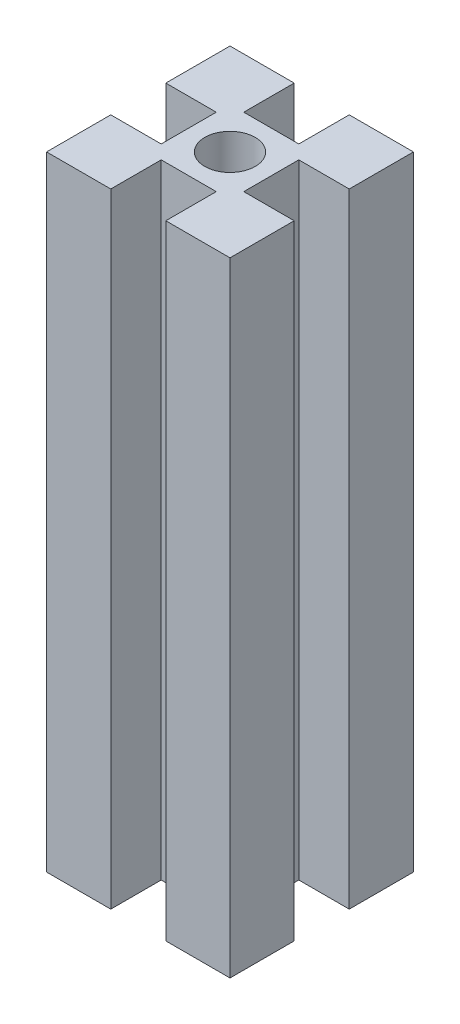
ISO-10303-21;
HEADER;
FILE_DESCRIPTION(('STEP AP214'),'2;1');
FILE_NAME('part.step','',(''),(''),'','','');
FILE_SCHEMA(('AUTOMOTIVE_DESIGN { 1 0 10303 214 1 1 1 1 }'));
ENDSEC;
DATA;
#1=APPLICATION_CONTEXT('core data for automotive mechanical design processes');
#2=APPLICATION_PROTOCOL_DEFINITION('international standard','automotive_design',2000,#1);
#3=PRODUCT_CONTEXT('',#1,'mechanical');
#4=PRODUCT('Part','Part','',(#3));
#5=PRODUCT_RELATED_PRODUCT_CATEGORY('part','',(#4));
#6=PRODUCT_DEFINITION_FORMATION('','',#4);
#7=PRODUCT_DEFINITION_CONTEXT('part definition',#1,'design');
#8=PRODUCT_DEFINITION('design','',#6,#7);
#9=PRODUCT_DEFINITION_SHAPE('','',#8);
#10=(LENGTH_UNIT() NAMED_UNIT(*) SI_UNIT(.MILLI.,.METRE.));
#11=(NAMED_UNIT(*) PLANE_ANGLE_UNIT() SI_UNIT($,.RADIAN.));
#12=(NAMED_UNIT(*) SI_UNIT($,.STERADIAN.) SOLID_ANGLE_UNIT());
#13=UNCERTAINTY_MEASURE_WITH_UNIT(LENGTH_MEASURE(1.E-05),#10,'distance_accuracy_value','');
#14=(GEOMETRIC_REPRESENTATION_CONTEXT(3) GLOBAL_UNCERTAINTY_ASSIGNED_CONTEXT((#13)) GLOBAL_UNIT_ASSIGNED_CONTEXT((#10,
#11,#12)) REPRESENTATION_CONTEXT('',''));
#15=CARTESIAN_POINT('',(0.,0.,0.));
#16=DIRECTION('',(0.,0.,1.));
#17=DIRECTION('',(1.,0.,0.));
#18=AXIS2_PLACEMENT_3D('',#15,#16,#17);
#19=CARTESIAN_POINT('',(-10.,68.,10.));
#20=DIRECTION('',(1.,0.,0.));
#21=DIRECTION('',(0.,0.,-1.));
#22=AXIS2_PLACEMENT_3D('',#19,#20,#21);
#23=PLANE('',#22);
#24=DIRECTION('',(0.,0.,1.));
#25=VECTOR('',#24,1.);
#26=CARTESIAN_POINT('',(-10.,68.,10.));
#27=LINE('',#26,#25);
#28=CARTESIAN_POINT('',(-10.,68.,3.));
#29=VERTEX_POINT('',#28);
#30=CARTESIAN_POINT('',(-10.,68.,10.));
#31=VERTEX_POINT('',#30);
#32=EDGE_CURVE('E295',#29,#31,#27,.T.);
#33=ORIENTED_EDGE('',*,*,#32,.F.);
#34=DIRECTION('',(0.,1.,0.));
#35=VECTOR('',#34,1.);
#36=CARTESIAN_POINT('',(-10.,0.,3.));
#37=LINE('',#36,#35);
#38=CARTESIAN_POINT('',(-10.,0.,3.));
#39=VERTEX_POINT('',#38);
#40=EDGE_CURVE('E203',#39,#29,#37,.T.);
#41=ORIENTED_EDGE('',*,*,#40,.F.);
#42=DIRECTION('',(0.,0.,1.));
#43=VECTOR('',#42,1.);
#44=CARTESIAN_POINT('',(-10.,0.,10.));
#45=LINE('',#44,#43);
#46=CARTESIAN_POINT('',(-10.,0.,10.));
#47=VERTEX_POINT('',#46);
#48=EDGE_CURVE('E288',#39,#47,#45,.T.);
#49=ORIENTED_EDGE('',*,*,#48,.T.);
#50=DIRECTION('',(0.,-1.,0.));
#51=VECTOR('',#50,1.);
#52=CARTESIAN_POINT('',(-10.,68.,10.));
#53=LINE('',#52,#51);
#54=EDGE_CURVE('E11',#31,#47,#53,.T.);
#55=ORIENTED_EDGE('',*,*,#54,.F.);
#56=EDGE_LOOP('',(#33,#41,#49,#55));
#57=FACE_BOUND('',#56,.T.);
#58=ADVANCED_FACE('F33',(#57),#23,.F.);
#59=CARTESIAN_POINT('',(10.,68.,10.));
#60=DIRECTION('',(0.,0.,-1.));
#61=DIRECTION('',(-1.,0.,0.));
#62=AXIS2_PLACEMENT_3D('',#59,#60,#61);
#63=PLANE('',#62);
#64=DIRECTION('',(1.,0.,0.));
#65=VECTOR('',#64,1.);
#66=CARTESIAN_POINT('',(10.,68.,10.));
#67=LINE('',#66,#65);
#68=CARTESIAN_POINT('',(3.,68.,10.));
#69=VERTEX_POINT('',#68);
#70=CARTESIAN_POINT('',(10.,68.,10.));
#71=VERTEX_POINT('',#70);
#72=EDGE_CURVE('E294',#69,#71,#67,.T.);
#73=ORIENTED_EDGE('',*,*,#72,.F.);
#74=DIRECTION('',(0.,1.,0.));
#75=VECTOR('',#74,1.);
#76=CARTESIAN_POINT('',(3.,0.,10.));
#77=LINE('',#76,#75);
#78=CARTESIAN_POINT('',(3.,0.,10.));
#79=VERTEX_POINT('',#78);
#80=EDGE_CURVE('E205',#79,#69,#77,.T.);
#81=ORIENTED_EDGE('',*,*,#80,.F.);
#82=DIRECTION('',(1.,0.,0.));
#83=VECTOR('',#82,1.);
#84=CARTESIAN_POINT('',(10.,0.,10.));
#85=LINE('',#84,#83);
#86=CARTESIAN_POINT('',(10.,0.,10.));
#87=VERTEX_POINT('',#86);
#88=EDGE_CURVE('E195',#79,#87,#85,.T.);
#89=ORIENTED_EDGE('',*,*,#88,.T.);
#90=DIRECTION('',(0.,-1.,0.));
#91=VECTOR('',#90,1.);
#92=CARTESIAN_POINT('',(10.,68.,10.));
#93=LINE('',#92,#91);
#94=EDGE_CURVE('E41',#71,#87,#93,.T.);
#95=ORIENTED_EDGE('',*,*,#94,.F.);
#96=EDGE_LOOP('',(#73,#81,#89,#95));
#97=FACE_BOUND('',#96,.T.);
#98=ADVANCED_FACE('F344',(#97),#63,.F.);
#99=CARTESIAN_POINT('',(10.,68.,10.));
#100=DIRECTION('',(-1.,0.,0.));
#101=DIRECTION('',(0.,0.,1.));
#102=AXIS2_PLACEMENT_3D('',#99,#100,#101);
#103=PLANE('',#102);
#104=DIRECTION('',(0.,0.,-1.));
#105=VECTOR('',#104,1.);
#106=CARTESIAN_POINT('',(10.,68.,10.));
#107=LINE('',#106,#105);
#108=CARTESIAN_POINT('',(10.,68.,-3.));
#109=VERTEX_POINT('',#108);
#110=CARTESIAN_POINT('',(10.,68.,-10.));
#111=VERTEX_POINT('',#110);
#112=EDGE_CURVE('E299',#109,#111,#107,.T.);
#113=ORIENTED_EDGE('',*,*,#112,.F.);
#114=DIRECTION('',(0.,1.,0.));
#115=VECTOR('',#114,1.);
#116=CARTESIAN_POINT('',(10.,0.,-3.));
#117=LINE('',#116,#115);
#118=CARTESIAN_POINT('',(10.,0.,-3.));
#119=VERTEX_POINT('',#118);
#120=EDGE_CURVE('E250',#119,#109,#117,.T.);
#121=ORIENTED_EDGE('',*,*,#120,.F.);
#122=DIRECTION('',(0.,0.,-1.));
#123=VECTOR('',#122,1.);
#124=CARTESIAN_POINT('',(10.,0.,10.));
#125=LINE('',#124,#123);
#126=CARTESIAN_POINT('',(10.,0.,-10.));
#127=VERTEX_POINT('',#126);
#128=EDGE_CURVE('E314',#119,#127,#125,.T.);
#129=ORIENTED_EDGE('',*,*,#128,.T.);
#130=DIRECTION('',(0.,-1.,0.));
#131=VECTOR('',#130,1.);
#132=CARTESIAN_POINT('',(10.,68.,-10.));
#133=LINE('',#132,#131);
#134=EDGE_CURVE('E324',#111,#127,#133,.T.);
#135=ORIENTED_EDGE('',*,*,#134,.F.);
#136=EDGE_LOOP('',(#113,#121,#129,#135));
#137=FACE_BOUND('',#136,.T.);
#138=ADVANCED_FACE('F346',(#137),#103,.F.);
#139=CARTESIAN_POINT('',(10.,68.,-10.));
#140=DIRECTION('',(0.,0.,1.));
#141=DIRECTION('',(1.,0.,0.));
#142=AXIS2_PLACEMENT_3D('',#139,#140,#141);
#143=PLANE('',#142);
#144=DIRECTION('',(-1.,0.,0.));
#145=VECTOR('',#144,1.);
#146=CARTESIAN_POINT('',(10.,68.,-10.));
#147=LINE('',#146,#145);
#148=CARTESIAN_POINT('',(-3.,68.,-10.));
#149=VERTEX_POINT('',#148);
#150=CARTESIAN_POINT('',(-10.,68.,-10.));
#151=VERTEX_POINT('',#150);
#152=EDGE_CURVE('E303',#149,#151,#147,.T.);
#153=ORIENTED_EDGE('',*,*,#152,.F.);
#154=DIRECTION('',(0.,1.,0.));
#155=VECTOR('',#154,1.);
#156=CARTESIAN_POINT('',(-3.,0.,-10.));
#157=LINE('',#156,#155);
#158=CARTESIAN_POINT('',(-3.,0.,-10.));
#159=VERTEX_POINT('',#158);
#160=EDGE_CURVE('E254',#159,#149,#157,.T.);
#161=ORIENTED_EDGE('',*,*,#160,.F.);
#162=DIRECTION('',(-1.,0.,0.));
#163=VECTOR('',#162,1.);
#164=CARTESIAN_POINT('',(10.,0.,-10.));
#165=LINE('',#164,#163);
#166=CARTESIAN_POINT('',(-10.,0.,-10.));
#167=VERTEX_POINT('',#166);
#168=EDGE_CURVE('E318',#159,#167,#165,.T.);
#169=ORIENTED_EDGE('',*,*,#168,.T.);
#170=DIRECTION('',(0.,-1.,0.));
#171=VECTOR('',#170,1.);
#172=CARTESIAN_POINT('',(-10.,68.,-10.));
#173=LINE('',#172,#171);
#174=EDGE_CURVE('E307',#151,#167,#173,.T.);
#175=ORIENTED_EDGE('',*,*,#174,.F.);
#176=EDGE_LOOP('',(#153,#161,#169,#175));
#177=FACE_BOUND('',#176,.T.);
#178=ADVANCED_FACE('F352',(#177),#143,.F.);
#179=CARTESIAN_POINT('',(-10.,0.,-3.));
#180=VERTEX_POINT('',#179);
#181=EDGE_CURVE('E308',#167,#180,#45,.T.);
#182=ORIENTED_EDGE('',*,*,#181,.T.);
#183=DIRECTION('',(0.,1.,0.));
#184=VECTOR('',#183,1.);
#185=CARTESIAN_POINT('',(-10.,0.,-3.));
#186=LINE('',#185,#184);
#187=CARTESIAN_POINT('',(-10.,68.,-3.));
#188=VERTEX_POINT('',#187);
#189=EDGE_CURVE('E231',#180,#188,#186,.T.);
#190=ORIENTED_EDGE('',*,*,#189,.T.);
#191=EDGE_CURVE('E291',#151,#188,#27,.T.);
#192=ORIENTED_EDGE('',*,*,#191,.F.);
#193=ORIENTED_EDGE('',*,*,#174,.T.);
#194=EDGE_LOOP('',(#182,#190,#192,#193));
#195=FACE_BOUND('',#194,.T.);
#196=ADVANCED_FACE('F35',(#195),#23,.F.);
#197=CARTESIAN_POINT('',(-3.,0.,10.));
#198=VERTEX_POINT('',#197);
#199=EDGE_CURVE('E311',#47,#198,#85,.T.);
#200=ORIENTED_EDGE('',*,*,#199,.T.);
#201=DIRECTION('',(0.,1.,0.));
#202=VECTOR('',#201,1.);
#203=CARTESIAN_POINT('',(-3.,0.,10.));
#204=LINE('',#203,#202);
#205=CARTESIAN_POINT('',(-3.,68.,10.));
#206=VERTEX_POINT('',#205);
#207=EDGE_CURVE('E208',#198,#206,#204,.T.);
#208=ORIENTED_EDGE('',*,*,#207,.T.);
#209=EDGE_CURVE('E296',#31,#206,#67,.T.);
#210=ORIENTED_EDGE('',*,*,#209,.F.);
#211=ORIENTED_EDGE('',*,*,#54,.T.);
#212=EDGE_LOOP('',(#200,#208,#210,#211));
#213=FACE_BOUND('',#212,.T.);
#214=ADVANCED_FACE('F347',(#213),#63,.F.);
#215=CARTESIAN_POINT('',(10.,0.,3.));
#216=VERTEX_POINT('',#215);
#217=EDGE_CURVE('E315',#87,#216,#125,.T.);
#218=ORIENTED_EDGE('',*,*,#217,.T.);
#219=DIRECTION('',(0.,1.,0.));
#220=VECTOR('',#219,1.);
#221=CARTESIAN_POINT('',(10.,0.,3.));
#222=LINE('',#221,#220);
#223=CARTESIAN_POINT('',(10.,68.,3.));
#224=VERTEX_POINT('',#223);
#225=EDGE_CURVE('E279',#216,#224,#222,.T.);
#226=ORIENTED_EDGE('',*,*,#225,.T.);
#227=EDGE_CURVE('E300',#71,#224,#107,.T.);
#228=ORIENTED_EDGE('',*,*,#227,.F.);
#229=ORIENTED_EDGE('',*,*,#94,.T.);
#230=EDGE_LOOP('',(#218,#226,#228,#229));
#231=FACE_BOUND('',#230,.T.);
#232=ADVANCED_FACE('F330',(#231),#103,.F.);
#233=CARTESIAN_POINT('',(3.,0.,-10.));
#234=VERTEX_POINT('',#233);
#235=EDGE_CURVE('E319',#127,#234,#165,.T.);
#236=ORIENTED_EDGE('',*,*,#235,.T.);
#237=DIRECTION('',(0.,1.,0.));
#238=VECTOR('',#237,1.);
#239=CARTESIAN_POINT('',(3.,0.,-10.));
#240=LINE('',#239,#238);
#241=CARTESIAN_POINT('',(3.,68.,-10.));
#242=VERTEX_POINT('',#241);
#243=EDGE_CURVE('E257',#234,#242,#240,.T.);
#244=ORIENTED_EDGE('',*,*,#243,.T.);
#245=EDGE_CURVE('E304',#111,#242,#147,.T.);
#246=ORIENTED_EDGE('',*,*,#245,.F.);
#247=ORIENTED_EDGE('',*,*,#134,.T.);
#248=EDGE_LOOP('',(#236,#244,#246,#247));
#249=FACE_BOUND('',#248,.T.);
#250=ADVANCED_FACE('F362',(#249),#143,.F.);
#251=CARTESIAN_POINT('',(0.,68.,0.));
#252=DIRECTION('',(0.,1.,0.));
#253=DIRECTION('',(0.,0.,1.));
#254=AXIS2_PLACEMENT_3D('',#251,#252,#253);
#255=PLANE('',#254);
#256=DIRECTION('',(0.,0.,1.));
#257=VECTOR('',#256,1.);
#258=CARTESIAN_POINT('',(-3.,68.,-10.));
#259=LINE('',#258,#257);
#260=CARTESIAN_POINT('',(-3.,68.,-4.5));
#261=VERTEX_POINT('',#260);
#262=EDGE_CURVE('E246',#149,#261,#259,.T.);
#263=ORIENTED_EDGE('',*,*,#262,.F.);
#264=ORIENTED_EDGE('',*,*,#152,.T.);
#265=ORIENTED_EDGE('',*,*,#191,.T.);
#266=DIRECTION('',(-1.,0.,0.));
#267=VECTOR('',#266,1.);
#268=CARTESIAN_POINT('',(-10.,68.,-3.));
#269=LINE('',#268,#267);
#270=CARTESIAN_POINT('',(-4.5,68.,-3.));
#271=VERTEX_POINT('',#270);
#272=EDGE_CURVE('E216',#271,#188,#269,.T.);
#273=ORIENTED_EDGE('',*,*,#272,.F.);
#274=DIRECTION('',(0.,0.,-1.));
#275=VECTOR('',#274,1.);
#276=CARTESIAN_POINT('',(-4.5,68.,3.));
#277=LINE('',#276,#275);
#278=CARTESIAN_POINT('',(-4.5,68.,3.));
#279=VERTEX_POINT('',#278);
#280=EDGE_CURVE('E226',#279,#271,#277,.T.);
#281=ORIENTED_EDGE('',*,*,#280,.F.);
#282=DIRECTION('',(1.,0.,0.));
#283=VECTOR('',#282,1.);
#284=CARTESIAN_POINT('',(-10.,68.,3.));
#285=LINE('',#284,#283);
#286=EDGE_CURVE('E223',#29,#279,#285,.T.);
#287=ORIENTED_EDGE('',*,*,#286,.F.);
#288=ORIENTED_EDGE('',*,*,#32,.T.);
#289=ORIENTED_EDGE('',*,*,#209,.T.);
#290=DIRECTION('',(0.,0.,1.));
#291=VECTOR('',#290,1.);
#292=CARTESIAN_POINT('',(-3.,68.,10.));
#293=LINE('',#292,#291);
#294=CARTESIAN_POINT('',(-3.,68.,4.5));
#295=VERTEX_POINT('',#294);
#296=EDGE_CURVE('E196',#295,#206,#293,.T.);
#297=ORIENTED_EDGE('',*,*,#296,.F.);
#298=DIRECTION('',(-1.,0.,0.));
#299=VECTOR('',#298,1.);
#300=CARTESIAN_POINT('',(3.,68.,4.5));
#301=LINE('',#300,#299);
#302=CARTESIAN_POINT('',(3.,68.,4.5));
#303=VERTEX_POINT('',#302);
#304=EDGE_CURVE('E198',#303,#295,#301,.T.);
#305=ORIENTED_EDGE('',*,*,#304,.F.);
#306=DIRECTION('',(0.,0.,-1.));
#307=VECTOR('',#306,1.);
#308=CARTESIAN_POINT('',(3.,68.,10.));
#309=LINE('',#308,#307);
#310=EDGE_CURVE('E176',#69,#303,#309,.T.);
#311=ORIENTED_EDGE('',*,*,#310,.F.);
#312=ORIENTED_EDGE('',*,*,#72,.T.);
#313=ORIENTED_EDGE('',*,*,#227,.T.);
#314=DIRECTION('',(1.,0.,0.));
#315=VECTOR('',#314,1.);
#316=CARTESIAN_POINT('',(10.,68.,3.));
#317=LINE('',#316,#315);
#318=CARTESIAN_POINT('',(4.5,68.,3.));
#319=VERTEX_POINT('',#318);
#320=EDGE_CURVE('E267',#319,#224,#317,.T.);
#321=ORIENTED_EDGE('',*,*,#320,.F.);
#322=DIRECTION('',(0.,0.,1.));
#323=VECTOR('',#322,1.);
#324=CARTESIAN_POINT('',(4.5,68.,-3.));
#325=LINE('',#324,#323);
#326=CARTESIAN_POINT('',(4.5,68.,-3.));
#327=VERTEX_POINT('',#326);
#328=EDGE_CURVE('E274',#327,#319,#325,.T.);
#329=ORIENTED_EDGE('',*,*,#328,.F.);
#330=DIRECTION('',(-1.,0.,0.));
#331=VECTOR('',#330,1.);
#332=CARTESIAN_POINT('',(10.,68.,-3.));
#333=LINE('',#332,#331);
#334=EDGE_CURVE('E207',#109,#327,#333,.T.);
#335=ORIENTED_EDGE('',*,*,#334,.F.);
#336=ORIENTED_EDGE('',*,*,#112,.T.);
#337=ORIENTED_EDGE('',*,*,#245,.T.);
#338=DIRECTION('',(0.,0.,-1.));
#339=VECTOR('',#338,1.);
#340=CARTESIAN_POINT('',(3.,68.,-10.));
#341=LINE('',#340,#339);
#342=CARTESIAN_POINT('',(3.,68.,-4.5));
#343=VERTEX_POINT('',#342);
#344=EDGE_CURVE('E241',#343,#242,#341,.T.);
#345=ORIENTED_EDGE('',*,*,#344,.F.);
#346=DIRECTION('',(1.,0.,0.));
#347=VECTOR('',#346,1.);
#348=CARTESIAN_POINT('',(-3.,68.,-4.5));
#349=LINE('',#348,#347);
#350=EDGE_CURVE('E249',#261,#343,#349,.T.);
#351=ORIENTED_EDGE('',*,*,#350,.F.);
#352=EDGE_LOOP('',(#263,#264,#265,#273,#281,#287,#288,#289,#297,#305,#311,#312,#313,#321,#329,
#335,#336,#337,#345,#351));
#353=FACE_BOUND('',#352,.T.);
#354=CARTESIAN_POINT('',(0.,68.,0.));
#355=DIRECTION('',(0.,1.,0.));
#356=DIRECTION('',(0.,0.,1.));
#357=AXIS2_PLACEMENT_3D('',#354,#355,#356);
#358=CIRCLE('',#357,2.75);
#359=CARTESIAN_POINT('',(0.,68.,2.75));
#360=VERTEX_POINT('',#359);
#361=EDGE_CURVE('E256',#360,#360,#358,.T.);
#362=ORIENTED_EDGE('',*,*,#361,.F.);
#363=EDGE_LOOP('',(#362));
#364=FACE_BOUND('',#363,.T.);
#365=ADVANCED_FACE('F342',(#353,#364),#255,.T.);
#366=CARTESIAN_POINT('',(0.,0.,0.));
#367=DIRECTION('',(0.,1.,0.));
#368=DIRECTION('',(0.,0.,1.));
#369=AXIS2_PLACEMENT_3D('',#366,#367,#368);
#370=PLANE('',#369);
#371=ORIENTED_EDGE('',*,*,#168,.F.);
#372=DIRECTION('',(0.,0.,1.));
#373=VECTOR('',#372,1.);
#374=CARTESIAN_POINT('',(-3.,0.,-10.));
#375=LINE('',#374,#373);
#376=CARTESIAN_POINT('',(-3.,0.,-4.5));
#377=VERTEX_POINT('',#376);
#378=EDGE_CURVE('E237',#159,#377,#375,.T.);
#379=ORIENTED_EDGE('',*,*,#378,.T.);
#380=DIRECTION('',(1.,0.,0.));
#381=VECTOR('',#380,1.);
#382=CARTESIAN_POINT('',(-3.,0.,-4.5));
#383=LINE('',#382,#381);
#384=CARTESIAN_POINT('',(3.,0.,-4.5));
#385=VERTEX_POINT('',#384);
#386=EDGE_CURVE('E240',#377,#385,#383,.T.);
#387=ORIENTED_EDGE('',*,*,#386,.T.);
#388=DIRECTION('',(0.,0.,-1.));
#389=VECTOR('',#388,1.);
#390=CARTESIAN_POINT('',(3.,0.,-10.));
#391=LINE('',#390,#389);
#392=EDGE_CURVE('E48',#385,#234,#391,.T.);
#393=ORIENTED_EDGE('',*,*,#392,.T.);
#394=ORIENTED_EDGE('',*,*,#235,.F.);
#395=ORIENTED_EDGE('',*,*,#128,.F.);
#396=DIRECTION('',(-1.,0.,0.));
#397=VECTOR('',#396,1.);
#398=CARTESIAN_POINT('',(10.,0.,-3.));
#399=LINE('',#398,#397);
#400=CARTESIAN_POINT('',(4.5,0.,-3.));
#401=VERTEX_POINT('',#400);
#402=EDGE_CURVE('E263',#119,#401,#399,.T.);
#403=ORIENTED_EDGE('',*,*,#402,.T.);
#404=DIRECTION('',(0.,0.,1.));
#405=VECTOR('',#404,1.);
#406=CARTESIAN_POINT('',(4.5,0.,-3.));
#407=LINE('',#406,#405);
#408=CARTESIAN_POINT('',(4.5,0.,3.));
#409=VERTEX_POINT('',#408);
#410=EDGE_CURVE('E266',#401,#409,#407,.T.);
#411=ORIENTED_EDGE('',*,*,#410,.T.);
#412=DIRECTION('',(1.,0.,0.));
#413=VECTOR('',#412,1.);
#414=CARTESIAN_POINT('',(10.,0.,3.));
#415=LINE('',#414,#413);
#416=EDGE_CURVE('E56',#409,#216,#415,.T.);
#417=ORIENTED_EDGE('',*,*,#416,.T.);
#418=ORIENTED_EDGE('',*,*,#217,.F.);
#419=ORIENTED_EDGE('',*,*,#88,.F.);
#420=DIRECTION('',(0.,0.,-1.));
#421=VECTOR('',#420,1.);
#422=CARTESIAN_POINT('',(3.,0.,10.));
#423=LINE('',#422,#421);
#424=CARTESIAN_POINT('',(3.,0.,4.5));
#425=VERTEX_POINT('',#424);
#426=EDGE_CURVE('E173',#79,#425,#423,.T.);
#427=ORIENTED_EDGE('',*,*,#426,.T.);
#428=DIRECTION('',(-1.,0.,0.));
#429=VECTOR('',#428,1.);
#430=CARTESIAN_POINT('',(3.,0.,4.5));
#431=LINE('',#430,#429);
#432=CARTESIAN_POINT('',(-3.,0.,4.5));
#433=VERTEX_POINT('',#432);
#434=EDGE_CURVE('E185',#425,#433,#431,.T.);
#435=ORIENTED_EDGE('',*,*,#434,.T.);
#436=DIRECTION('',(0.,0.,1.));
#437=VECTOR('',#436,1.);
#438=CARTESIAN_POINT('',(-3.,0.,10.));
#439=LINE('',#438,#437);
#440=EDGE_CURVE('E181',#433,#198,#439,.T.);
#441=ORIENTED_EDGE('',*,*,#440,.T.);
#442=ORIENTED_EDGE('',*,*,#199,.F.);
#443=ORIENTED_EDGE('',*,*,#48,.F.);
#444=DIRECTION('',(1.,0.,0.));
#445=VECTOR('',#444,1.);
#446=CARTESIAN_POINT('',(-10.,0.,3.));
#447=LINE('',#446,#445);
#448=CARTESIAN_POINT('',(-4.5,0.,3.));
#449=VERTEX_POINT('',#448);
#450=EDGE_CURVE('E212',#39,#449,#447,.T.);
#451=ORIENTED_EDGE('',*,*,#450,.T.);
#452=DIRECTION('',(0.,0.,-1.));
#453=VECTOR('',#452,1.);
#454=CARTESIAN_POINT('',(-4.5,0.,3.));
#455=LINE('',#454,#453);
#456=CARTESIAN_POINT('',(-4.5,0.,-3.));
#457=VERTEX_POINT('',#456);
#458=EDGE_CURVE('E215',#449,#457,#455,.T.);
#459=ORIENTED_EDGE('',*,*,#458,.T.);
#460=DIRECTION('',(-1.,0.,0.));
#461=VECTOR('',#460,1.);
#462=CARTESIAN_POINT('',(-10.,0.,-3.));
#463=LINE('',#462,#461);
#464=EDGE_CURVE('E219',#457,#180,#463,.T.);
#465=ORIENTED_EDGE('',*,*,#464,.T.);
#466=ORIENTED_EDGE('',*,*,#181,.F.);
#467=EDGE_LOOP('',(#371,#379,#387,#393,#394,#395,#403,#411,#417,#418,#419,#427,#435,#441,#442,
#443,#451,#459,#465,#466));
#468=FACE_BOUND('',#467,.T.);
#469=CARTESIAN_POINT('',(0.,0.,0.));
#470=DIRECTION('',(0.,1.,0.));
#471=DIRECTION('',(0.,0.,1.));
#472=AXIS2_PLACEMENT_3D('',#469,#470,#471);
#473=CIRCLE('',#472,2.75);
#474=CARTESIAN_POINT('',(0.,0.,2.75));
#475=VERTEX_POINT('',#474);
#476=EDGE_CURVE('E285',#475,#475,#473,.T.);
#477=ORIENTED_EDGE('',*,*,#476,.T.);
#478=EDGE_LOOP('',(#477));
#479=FACE_BOUND('',#478,.T.);
#480=ADVANCED_FACE('F192',(#468,#479),#370,.F.);
#481=CARTESIAN_POINT('',(0.,0.,0.));
#482=DIRECTION('',(0.,1.,0.));
#483=DIRECTION('',(0.,0.,1.));
#484=AXIS2_PLACEMENT_3D('',#481,#482,#483);
#485=CYLINDRICAL_SURFACE('',#484,2.75);
#486=ORIENTED_EDGE('',*,*,#476,.F.);
#487=EDGE_LOOP('',(#486));
#488=FACE_BOUND('',#487,.T.);
#489=ORIENTED_EDGE('',*,*,#361,.T.);
#490=EDGE_LOOP('',(#489));
#491=FACE_BOUND('',#490,.T.);
#492=ADVANCED_FACE('F416',(#488,#491),#485,.F.);
#493=CARTESIAN_POINT('',(-10.,0.,3.));
#494=DIRECTION('',(0.,0.,1.));
#495=DIRECTION('',(1.,0.,0.));
#496=AXIS2_PLACEMENT_3D('',#493,#494,#495);
#497=PLANE('',#496);
#498=ORIENTED_EDGE('',*,*,#286,.T.);
#499=DIRECTION('',(0.,1.,0.));
#500=VECTOR('',#499,1.);
#501=CARTESIAN_POINT('',(-4.5,0.,3.));
#502=LINE('',#501,#500);
#503=EDGE_CURVE('E222',#449,#279,#502,.T.);
#504=ORIENTED_EDGE('',*,*,#503,.F.);
#505=ORIENTED_EDGE('',*,*,#450,.F.);
#506=ORIENTED_EDGE('',*,*,#40,.T.);
#507=EDGE_LOOP('',(#498,#504,#505,#506));
#508=FACE_BOUND('',#507,.T.);
#509=ADVANCED_FACE('F375',(#508),#497,.F.);
#510=CARTESIAN_POINT('',(-10.,0.,-3.));
#511=DIRECTION('',(0.,0.,-1.));
#512=DIRECTION('',(-1.,0.,0.));
#513=AXIS2_PLACEMENT_3D('',#510,#511,#512);
#514=PLANE('',#513);
#515=ORIENTED_EDGE('',*,*,#272,.T.);
#516=ORIENTED_EDGE('',*,*,#189,.F.);
#517=ORIENTED_EDGE('',*,*,#464,.F.);
#518=DIRECTION('',(0.,1.,0.));
#519=VECTOR('',#518,1.);
#520=CARTESIAN_POINT('',(-4.5,0.,-3.));
#521=LINE('',#520,#519);
#522=EDGE_CURVE('E234',#457,#271,#521,.T.);
#523=ORIENTED_EDGE('',*,*,#522,.T.);
#524=EDGE_LOOP('',(#515,#516,#517,#523));
#525=FACE_BOUND('',#524,.T.);
#526=ADVANCED_FACE('F478',(#525),#514,.F.);
#527=CARTESIAN_POINT('',(-4.5,0.,3.));
#528=DIRECTION('',(1.,0.,0.));
#529=DIRECTION('',(0.,0.,-1.));
#530=AXIS2_PLACEMENT_3D('',#527,#528,#529);
#531=PLANE('',#530);
#532=ORIENTED_EDGE('',*,*,#280,.T.);
#533=ORIENTED_EDGE('',*,*,#522,.F.);
#534=ORIENTED_EDGE('',*,*,#458,.F.);
#535=ORIENTED_EDGE('',*,*,#503,.T.);
#536=EDGE_LOOP('',(#532,#533,#534,#535));
#537=FACE_BOUND('',#536,.T.);
#538=ADVANCED_FACE('F380',(#537),#531,.F.);
#539=CARTESIAN_POINT('',(3.,0.,10.));
#540=DIRECTION('',(1.,0.,0.));
#541=DIRECTION('',(0.,0.,-1.));
#542=AXIS2_PLACEMENT_3D('',#539,#540,#541);
#543=PLANE('',#542);
#544=ORIENTED_EDGE('',*,*,#310,.T.);
#545=DIRECTION('',(0.,1.,0.));
#546=VECTOR('',#545,1.);
#547=CARTESIAN_POINT('',(3.,0.,4.5));
#548=LINE('',#547,#546);
#549=EDGE_CURVE('E169',#425,#303,#548,.T.);
#550=ORIENTED_EDGE('',*,*,#549,.F.);
#551=ORIENTED_EDGE('',*,*,#426,.F.);
#552=ORIENTED_EDGE('',*,*,#80,.T.);
#553=EDGE_LOOP('',(#544,#550,#551,#552));
#554=FACE_BOUND('',#553,.T.);
#555=ADVANCED_FACE('F171',(#554),#543,.F.);
#556=CARTESIAN_POINT('',(-3.,0.,10.));
#557=DIRECTION('',(-1.,0.,0.));
#558=DIRECTION('',(0.,0.,1.));
#559=AXIS2_PLACEMENT_3D('',#556,#557,#558);
#560=PLANE('',#559);
#561=ORIENTED_EDGE('',*,*,#296,.T.);
#562=ORIENTED_EDGE('',*,*,#207,.F.);
#563=ORIENTED_EDGE('',*,*,#440,.F.);
#564=DIRECTION('',(0.,1.,0.));
#565=VECTOR('',#564,1.);
#566=CARTESIAN_POINT('',(-3.,0.,4.5));
#567=LINE('',#566,#565);
#568=EDGE_CURVE('E180',#433,#295,#567,.T.);
#569=ORIENTED_EDGE('',*,*,#568,.T.);
#570=EDGE_LOOP('',(#561,#562,#563,#569));
#571=FACE_BOUND('',#570,.T.);
#572=ADVANCED_FACE('F369',(#571),#560,.F.);
#573=CARTESIAN_POINT('',(3.,0.,4.5));
#574=DIRECTION('',(0.,0.,-1.));
#575=DIRECTION('',(-1.,0.,0.));
#576=AXIS2_PLACEMENT_3D('',#573,#574,#575);
#577=PLANE('',#576);
#578=ORIENTED_EDGE('',*,*,#304,.T.);
#579=ORIENTED_EDGE('',*,*,#568,.F.);
#580=ORIENTED_EDGE('',*,*,#434,.F.);
#581=ORIENTED_EDGE('',*,*,#549,.T.);
#582=EDGE_LOOP('',(#578,#579,#580,#581));
#583=FACE_BOUND('',#582,.T.);
#584=ADVANCED_FACE('F186',(#583),#577,.F.);
#585=CARTESIAN_POINT('',(10.,0.,-3.));
#586=DIRECTION('',(0.,0.,-1.));
#587=DIRECTION('',(-1.,0.,0.));
#588=AXIS2_PLACEMENT_3D('',#585,#586,#587);
#589=PLANE('',#588);
#590=ORIENTED_EDGE('',*,*,#334,.T.);
#591=DIRECTION('',(0.,1.,0.));
#592=VECTOR('',#591,1.);
#593=CARTESIAN_POINT('',(4.5,0.,-3.));
#594=LINE('',#593,#592);
#595=EDGE_CURVE('E271',#401,#327,#594,.T.);
#596=ORIENTED_EDGE('',*,*,#595,.F.);
#597=ORIENTED_EDGE('',*,*,#402,.F.);
#598=ORIENTED_EDGE('',*,*,#120,.T.);
#599=EDGE_LOOP('',(#590,#596,#597,#598));
#600=FACE_BOUND('',#599,.T.);
#601=ADVANCED_FACE('F405',(#600),#589,.F.);
#602=CARTESIAN_POINT('',(10.,0.,3.));
#603=DIRECTION('',(0.,0.,1.));
#604=DIRECTION('',(1.,0.,0.));
#605=AXIS2_PLACEMENT_3D('',#602,#603,#604);
#606=PLANE('',#605);
#607=ORIENTED_EDGE('',*,*,#320,.T.);
#608=ORIENTED_EDGE('',*,*,#225,.F.);
#609=ORIENTED_EDGE('',*,*,#416,.F.);
#610=DIRECTION('',(0.,1.,0.));
#611=VECTOR('',#610,1.);
#612=CARTESIAN_POINT('',(4.5,0.,3.));
#613=LINE('',#612,#611);
#614=EDGE_CURVE('E282',#409,#319,#613,.T.);
#615=ORIENTED_EDGE('',*,*,#614,.T.);
#616=EDGE_LOOP('',(#607,#608,#609,#615));
#617=FACE_BOUND('',#616,.T.);
#618=ADVANCED_FACE('F339',(#617),#606,.F.);
#619=CARTESIAN_POINT('',(4.5,0.,-3.));
#620=DIRECTION('',(-1.,0.,0.));
#621=DIRECTION('',(0.,0.,1.));
#622=AXIS2_PLACEMENT_3D('',#619,#620,#621);
#623=PLANE('',#622);
#624=ORIENTED_EDGE('',*,*,#328,.T.);
#625=ORIENTED_EDGE('',*,*,#614,.F.);
#626=ORIENTED_EDGE('',*,*,#410,.F.);
#627=ORIENTED_EDGE('',*,*,#595,.T.);
#628=EDGE_LOOP('',(#624,#625,#626,#627));
#629=FACE_BOUND('',#628,.T.);
#630=ADVANCED_FACE('F336',(#629),#623,.F.);
#631=CARTESIAN_POINT('',(-3.,0.,-10.));
#632=DIRECTION('',(-1.,0.,0.));
#633=DIRECTION('',(0.,0.,1.));
#634=AXIS2_PLACEMENT_3D('',#631,#632,#633);
#635=PLANE('',#634);
#636=ORIENTED_EDGE('',*,*,#262,.T.);
#637=DIRECTION('',(0.,1.,0.));
#638=VECTOR('',#637,1.);
#639=CARTESIAN_POINT('',(-3.,0.,-4.5));
#640=LINE('',#639,#638);
#641=EDGE_CURVE('E245',#377,#261,#640,.T.);
#642=ORIENTED_EDGE('',*,*,#641,.F.);
#643=ORIENTED_EDGE('',*,*,#378,.F.);
#644=ORIENTED_EDGE('',*,*,#160,.T.);
#645=EDGE_LOOP('',(#636,#642,#643,#644));
#646=FACE_BOUND('',#645,.T.);
#647=ADVANCED_FACE('F391',(#646),#635,.F.);
#648=CARTESIAN_POINT('',(3.,0.,-10.));
#649=DIRECTION('',(1.,0.,0.));
#650=DIRECTION('',(0.,0.,-1.));
#651=AXIS2_PLACEMENT_3D('',#648,#649,#650);
#652=PLANE('',#651);
#653=ORIENTED_EDGE('',*,*,#344,.T.);
#654=ORIENTED_EDGE('',*,*,#243,.F.);
#655=ORIENTED_EDGE('',*,*,#392,.F.);
#656=DIRECTION('',(0.,1.,0.));
#657=VECTOR('',#656,1.);
#658=CARTESIAN_POINT('',(3.,0.,-4.5));
#659=LINE('',#658,#657);
#660=EDGE_CURVE('E260',#385,#343,#659,.T.);
#661=ORIENTED_EDGE('',*,*,#660,.T.);
#662=EDGE_LOOP('',(#653,#654,#655,#661));
#663=FACE_BOUND('',#662,.T.);
#664=ADVANCED_FACE('F396',(#663),#652,.F.);
#665=CARTESIAN_POINT('',(-3.,0.,-4.5));
#666=DIRECTION('',(0.,0.,1.));
#667=DIRECTION('',(1.,0.,0.));
#668=AXIS2_PLACEMENT_3D('',#665,#666,#667);
#669=PLANE('',#668);
#670=ORIENTED_EDGE('',*,*,#350,.T.);
#671=ORIENTED_EDGE('',*,*,#660,.F.);
#672=ORIENTED_EDGE('',*,*,#386,.F.);
#673=ORIENTED_EDGE('',*,*,#641,.T.);
#674=EDGE_LOOP('',(#670,#671,#672,#673));
#675=FACE_BOUND('',#674,.T.);
#676=ADVANCED_FACE('F394',(#675),#669,.F.);
#677=CLOSED_SHELL('',(#58,#98,#138,#178,#196,#214,#232,#250,#365,#480,#492,#509,#526,#538,#555,
#572,#584,#601,#618,#630,#647,#664,#676));
#678=MANIFOLD_SOLID_BREP('B2',#677);
#679=ADVANCED_BREP_SHAPE_REPRESENTATION('',(#18,#678),#14);
#680=SHAPE_DEFINITION_REPRESENTATION(#9,#679);
ENDSEC;
END-ISO-10303-21;
